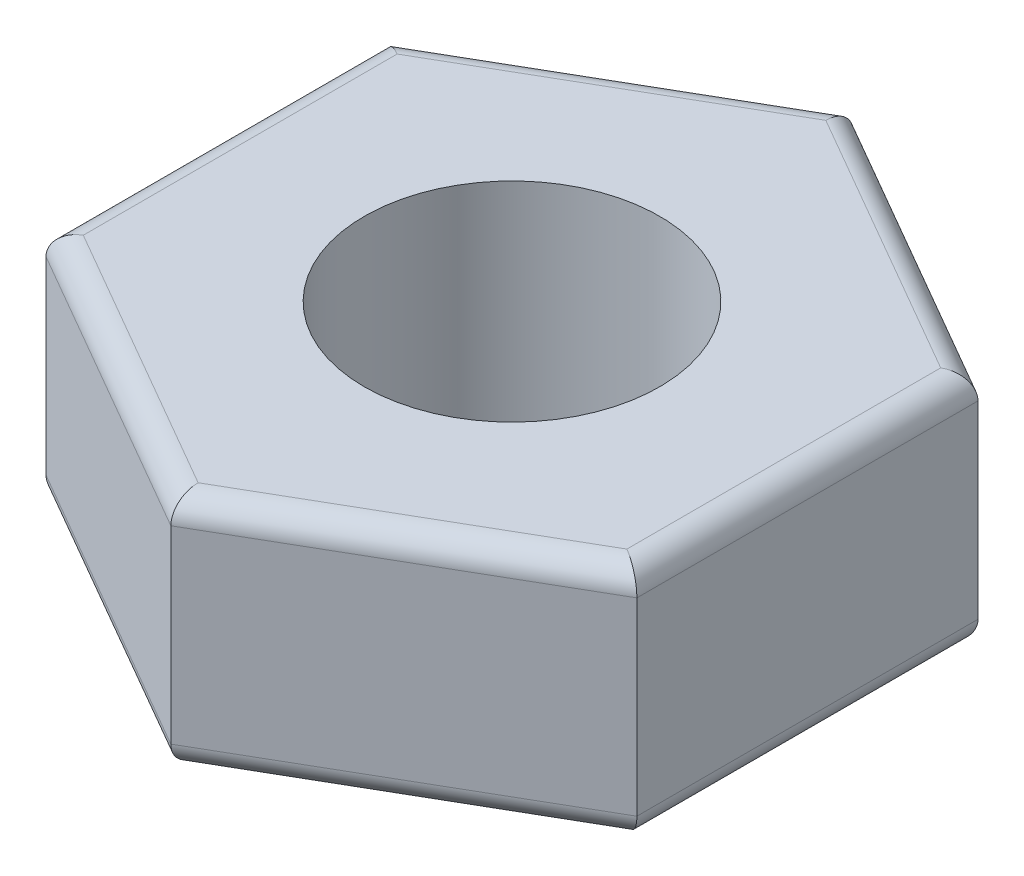
ISO-10303-21;
HEADER;
FILE_DESCRIPTION(('STEP AP214'),'2;1');
FILE_NAME('part.step','',(''),(''),'','','');
FILE_SCHEMA(('AUTOMOTIVE_DESIGN { 1 0 10303 214 1 1 1 1 }'));
ENDSEC;
DATA;
#1=APPLICATION_CONTEXT('core data for automotive mechanical design processes');
#2=APPLICATION_PROTOCOL_DEFINITION('international standard','automotive_design',2000,#1);
#3=PRODUCT_CONTEXT('',#1,'mechanical');
#4=PRODUCT('Part','Part','',(#3));
#5=PRODUCT_RELATED_PRODUCT_CATEGORY('part','',(#4));
#6=PRODUCT_DEFINITION_FORMATION('','',#4);
#7=PRODUCT_DEFINITION_CONTEXT('part definition',#1,'design');
#8=PRODUCT_DEFINITION('design','',#6,#7);
#9=PRODUCT_DEFINITION_SHAPE('','',#8);
#10=(LENGTH_UNIT() NAMED_UNIT(*) SI_UNIT(.MILLI.,.METRE.));
#11=(NAMED_UNIT(*) PLANE_ANGLE_UNIT() SI_UNIT($,.RADIAN.));
#12=(NAMED_UNIT(*) SI_UNIT($,.STERADIAN.) SOLID_ANGLE_UNIT());
#13=UNCERTAINTY_MEASURE_WITH_UNIT(LENGTH_MEASURE(1.E-05),#10,'distance_accuracy_value','');
#14=(GEOMETRIC_REPRESENTATION_CONTEXT(3) GLOBAL_UNCERTAINTY_ASSIGNED_CONTEXT((#13)) GLOBAL_UNIT_ASSIGNED_CONTEXT((#10,
#11,#12)) REPRESENTATION_CONTEXT('',''));
#15=CARTESIAN_POINT('',(0.,0.,0.));
#16=DIRECTION('',(0.,0.,1.));
#17=DIRECTION('',(1.,0.,0.));
#18=AXIS2_PLACEMENT_3D('',#15,#16,#17);
#19=CARTESIAN_POINT('',(0.,4.,0.));
#20=DIRECTION('',(0.,1.,0.));
#21=DIRECTION('',(0.,0.,1.));
#22=AXIS2_PLACEMENT_3D('',#19,#20,#21);
#23=PLANE('',#22);
#24=DIRECTION('',(-0.866025403784439,0.,0.5));
#25=VECTOR('',#24,1.);
#26=CARTESIAN_POINT('',(-4.8,4.,-2.54034118443435));
#27=LINE('',#26,#25);
#28=CARTESIAN_POINT('',(0.,4.,-5.31162247654456));
#29=VERTEX_POINT('',#28);
#30=CARTESIAN_POINT('',(-4.6,4.,-2.65581123827228));
#31=VERTEX_POINT('',#30);
#32=EDGE_CURVE('E52',#29,#31,#27,.T.);
#33=ORIENTED_EDGE('',*,*,#32,.T.);
#34=DIRECTION('',(0.,0.,1.));
#35=VECTOR('',#34,1.);
#36=CARTESIAN_POINT('',(-4.6,4.,2.88675134594813));
#37=LINE('',#36,#35);
#38=CARTESIAN_POINT('',(-4.6,4.,2.65581123827228));
#39=VERTEX_POINT('',#38);
#40=EDGE_CURVE('E11',#31,#39,#37,.T.);
#41=ORIENTED_EDGE('',*,*,#40,.T.);
#42=DIRECTION('',(0.866025403784439,0.,0.5));
#43=VECTOR('',#42,1.);
#44=CARTESIAN_POINT('',(0.200000000000001,4.,5.42709253038248));
#45=LINE('',#44,#43);
#46=CARTESIAN_POINT('',(0.,4.,5.31162247654456));
#47=VERTEX_POINT('',#46);
#48=EDGE_CURVE('E196',#39,#47,#45,.T.);
#49=ORIENTED_EDGE('',*,*,#48,.T.);
#50=DIRECTION('',(0.866025403784439,0.,-0.5));
#51=VECTOR('',#50,1.);
#52=CARTESIAN_POINT('',(4.8,4.,2.54034118443435));
#53=LINE('',#52,#51);
#54=CARTESIAN_POINT('',(4.6,4.,2.65581123827228));
#55=VERTEX_POINT('',#54);
#56=EDGE_CURVE('E194',#47,#55,#53,.T.);
#57=ORIENTED_EDGE('',*,*,#56,.T.);
#58=DIRECTION('',(0.,0.,-1.));
#59=VECTOR('',#58,1.);
#60=CARTESIAN_POINT('',(4.6,4.,-2.88675134594813));
#61=LINE('',#60,#59);
#62=CARTESIAN_POINT('',(4.6,4.,-2.65581123827228));
#63=VERTEX_POINT('',#62);
#64=EDGE_CURVE('E192',#55,#63,#61,.T.);
#65=ORIENTED_EDGE('',*,*,#64,.T.);
#66=DIRECTION('',(-0.866025403784439,0.,-0.5));
#67=VECTOR('',#66,1.);
#68=CARTESIAN_POINT('',(-0.200000000000001,4.,-5.42709253038248));
#69=LINE('',#68,#67);
#70=EDGE_CURVE('E63',#63,#29,#69,.T.);
#71=ORIENTED_EDGE('',*,*,#70,.T.);
#72=EDGE_LOOP('',(#33,#41,#49,#57,#65,#71));
#73=FACE_BOUND('',#72,.T.);
#74=CARTESIAN_POINT('',(0.,4.,0.));
#75=DIRECTION('',(0.,1.,0.));
#76=DIRECTION('',(0.,0.,1.));
#77=AXIS2_PLACEMENT_3D('',#74,#75,#76);
#78=CIRCLE('',#77,2.5);
#79=CARTESIAN_POINT('',(0.,4.,2.5));
#80=VERTEX_POINT('',#79);
#81=EDGE_CURVE('E240',#80,#80,#78,.T.);
#82=ORIENTED_EDGE('',*,*,#81,.F.);
#83=EDGE_LOOP('',(#82));
#84=FACE_BOUND('',#83,.T.);
#85=ADVANCED_FACE('F43',(#73,#84),#23,.T.);
#86=CARTESIAN_POINT('',(0.,0.,0.));
#87=DIRECTION('',(0.,1.,0.));
#88=DIRECTION('',(0.,0.,1.));
#89=AXIS2_PLACEMENT_3D('',#86,#87,#88);
#90=PLANE('',#89);
#91=DIRECTION('',(-0.866025403784439,0.,0.5));
#92=VECTOR('',#91,1.);
#93=CARTESIAN_POINT('',(-2.3,0.,-3.98371685740842));
#94=LINE('',#93,#92);
#95=CARTESIAN_POINT('',(-4.6,0.,-2.65581123827228));
#96=VERTEX_POINT('',#95);
#97=CARTESIAN_POINT('',(0.,0.,-5.31162247654456));
#98=VERTEX_POINT('',#97);
#99=EDGE_CURVE('E221',#96,#98,#94,.F.);
#100=ORIENTED_EDGE('',*,*,#99,.T.);
#101=DIRECTION('',(-0.866025403784439,0.,-0.5));
#102=VECTOR('',#101,1.);
#103=CARTESIAN_POINT('',(2.3,0.,-3.98371685740842));
#104=LINE('',#103,#102);
#105=CARTESIAN_POINT('',(4.6,0.,-2.65581123827228));
#106=VERTEX_POINT('',#105);
#107=EDGE_CURVE('E214',#98,#106,#104,.F.);
#108=ORIENTED_EDGE('',*,*,#107,.T.);
#109=DIRECTION('',(0.,0.,-1.));
#110=VECTOR('',#109,1.);
#111=CARTESIAN_POINT('',(4.6,0.,0.));
#112=LINE('',#111,#110);
#113=CARTESIAN_POINT('',(4.6,0.,2.65581123827228));
#114=VERTEX_POINT('',#113);
#115=EDGE_CURVE('E217',#106,#114,#112,.F.);
#116=ORIENTED_EDGE('',*,*,#115,.T.);
#117=DIRECTION('',(0.866025403784439,0.,-0.5));
#118=VECTOR('',#117,1.);
#119=CARTESIAN_POINT('',(2.3,0.,3.98371685740842));
#120=LINE('',#119,#118);
#121=CARTESIAN_POINT('',(0.,0.,5.31162247654456));
#122=VERTEX_POINT('',#121);
#123=EDGE_CURVE('E219',#114,#122,#120,.F.);
#124=ORIENTED_EDGE('',*,*,#123,.T.);
#125=DIRECTION('',(0.866025403784439,0.,0.5));
#126=VECTOR('',#125,1.);
#127=CARTESIAN_POINT('',(-2.3,0.,3.98371685740842));
#128=LINE('',#127,#126);
#129=CARTESIAN_POINT('',(-4.6,0.,2.65581123827228));
#130=VERTEX_POINT('',#129);
#131=EDGE_CURVE('E225',#122,#130,#128,.F.);
#132=ORIENTED_EDGE('',*,*,#131,.T.);
#133=DIRECTION('',(0.,0.,1.));
#134=VECTOR('',#133,1.);
#135=CARTESIAN_POINT('',(-4.6,0.,0.));
#136=LINE('',#135,#134);
#137=EDGE_CURVE('E223',#130,#96,#136,.F.);
#138=ORIENTED_EDGE('',*,*,#137,.T.);
#139=EDGE_LOOP('',(#100,#108,#116,#124,#132,#138));
#140=FACE_BOUND('',#139,.T.);
#141=CARTESIAN_POINT('',(0.,0.,0.));
#142=DIRECTION('',(0.,1.,0.));
#143=DIRECTION('',(0.,0.,1.));
#144=AXIS2_PLACEMENT_3D('',#141,#142,#143);
#145=CIRCLE('',#144,2.5);
#146=CARTESIAN_POINT('',(0.,0.,2.5));
#147=VERTEX_POINT('',#146);
#148=EDGE_CURVE('E176',#147,#147,#145,.T.);
#149=ORIENTED_EDGE('',*,*,#148,.T.);
#150=EDGE_LOOP('',(#149));
#151=FACE_BOUND('',#150,.T.);
#152=ADVANCED_FACE('F250',(#140,#151),#90,.F.);
#153=CARTESIAN_POINT('',(5.,4.,-2.88675134594813));
#154=DIRECTION('',(-0.5,0.,0.866025403784439));
#155=DIRECTION('',(0.866025403784439,0.,0.5));
#156=AXIS2_PLACEMENT_3D('',#153,#154,#155);
#157=PLANE('',#156);
#158=DIRECTION('',(0.,-1.,0.));
#159=VECTOR('',#158,1.);
#160=CARTESIAN_POINT('',(5.,4.,-2.88675134594813));
#161=LINE('',#160,#159);
#162=CARTESIAN_POINT('',(5.,3.6,-2.88675134594813));
#163=VERTEX_POINT('',#162);
#164=CARTESIAN_POINT('',(5.,0.4,-2.88675134594813));
#165=VERTEX_POINT('',#164);
#166=EDGE_CURVE('E238',#163,#165,#161,.T.);
#167=ORIENTED_EDGE('',*,*,#166,.T.);
#168=DIRECTION('',(-0.866025403784439,0.,-0.5));
#169=VECTOR('',#168,1.);
#170=CARTESIAN_POINT('',(5.,0.4,-2.88675134594813));
#171=LINE('',#170,#169);
#172=CARTESIAN_POINT('',(0.,0.4,-5.77350269189626));
#173=VERTEX_POINT('',#172);
#174=EDGE_CURVE('E153',#165,#173,#171,.T.);
#175=ORIENTED_EDGE('',*,*,#174,.T.);
#176=DIRECTION('',(0.,-1.,0.));
#177=VECTOR('',#176,1.);
#178=CARTESIAN_POINT('',(0.,4.,-5.77350269189626));
#179=LINE('',#178,#177);
#180=CARTESIAN_POINT('',(0.,3.6,-5.77350269189626));
#181=VERTEX_POINT('',#180);
#182=EDGE_CURVE('E136',#181,#173,#179,.T.);
#183=ORIENTED_EDGE('',*,*,#182,.F.);
#184=DIRECTION('',(-0.866025403784439,0.,-0.5));
#185=VECTOR('',#184,1.);
#186=CARTESIAN_POINT('',(5.,3.6,-2.88675134594813));
#187=LINE('',#186,#185);
#188=EDGE_CURVE('E150',#181,#163,#187,.F.);
#189=ORIENTED_EDGE('',*,*,#188,.T.);
#190=EDGE_LOOP('',(#167,#175,#183,#189));
#191=FACE_BOUND('',#190,.T.);
#192=ADVANCED_FACE('F149',(#191),#157,.F.);
#193=CARTESIAN_POINT('',(0.,4.,-5.77350269189626));
#194=DIRECTION('',(0.5,0.,0.866025403784439));
#195=DIRECTION('',(0.866025403784439,0.,-0.5));
#196=AXIS2_PLACEMENT_3D('',#193,#194,#195);
#197=PLANE('',#196);
#198=ORIENTED_EDGE('',*,*,#182,.T.);
#199=DIRECTION('',(-0.866025403784439,0.,0.5));
#200=VECTOR('',#199,1.);
#201=CARTESIAN_POINT('',(0.,0.4,-5.77350269189626));
#202=LINE('',#201,#200);
#203=CARTESIAN_POINT('',(-5.,0.4,-2.88675134594813));
#204=VERTEX_POINT('',#203);
#205=EDGE_CURVE('E142',#173,#204,#202,.T.);
#206=ORIENTED_EDGE('',*,*,#205,.T.);
#207=DIRECTION('',(0.,-1.,0.));
#208=VECTOR('',#207,1.);
#209=CARTESIAN_POINT('',(-5.,4.,-2.88675134594813));
#210=LINE('',#209,#208);
#211=CARTESIAN_POINT('',(-5.,3.6,-2.88675134594813));
#212=VERTEX_POINT('',#211);
#213=EDGE_CURVE('E138',#212,#204,#210,.T.);
#214=ORIENTED_EDGE('',*,*,#213,.F.);
#215=DIRECTION('',(-0.866025403784439,0.,0.5));
#216=VECTOR('',#215,1.);
#217=CARTESIAN_POINT('',(0.,3.6,-5.77350269189626));
#218=LINE('',#217,#216);
#219=EDGE_CURVE('E133',#212,#181,#218,.F.);
#220=ORIENTED_EDGE('',*,*,#219,.T.);
#221=EDGE_LOOP('',(#198,#206,#214,#220));
#222=FACE_BOUND('',#221,.T.);
#223=ADVANCED_FACE('F135',(#222),#197,.F.);
#224=CARTESIAN_POINT('',(-5.,4.,-2.88675134594813));
#225=DIRECTION('',(1.,0.,0.));
#226=DIRECTION('',(0.,0.,-1.));
#227=AXIS2_PLACEMENT_3D('',#224,#225,#226);
#228=PLANE('',#227);
#229=ORIENTED_EDGE('',*,*,#213,.T.);
#230=DIRECTION('',(0.,0.,1.));
#231=VECTOR('',#230,1.);
#232=CARTESIAN_POINT('',(-5.,0.4,-2.88675134594813));
#233=LINE('',#232,#231);
#234=CARTESIAN_POINT('',(-5.,0.4,2.88675134594813));
#235=VERTEX_POINT('',#234);
#236=EDGE_CURVE('E202',#204,#235,#233,.T.);
#237=ORIENTED_EDGE('',*,*,#236,.T.);
#238=DIRECTION('',(0.,-1.,0.));
#239=VECTOR('',#238,1.);
#240=CARTESIAN_POINT('',(-5.,4.,2.88675134594813));
#241=LINE('',#240,#239);
#242=CARTESIAN_POINT('',(-5.,3.6,2.88675134594813));
#243=VERTEX_POINT('',#242);
#244=EDGE_CURVE('E229',#243,#235,#241,.T.);
#245=ORIENTED_EDGE('',*,*,#244,.F.);
#246=DIRECTION('',(0.,0.,1.));
#247=VECTOR('',#246,1.);
#248=CARTESIAN_POINT('',(-5.,3.6,-2.88675134594813));
#249=LINE('',#248,#247);
#250=EDGE_CURVE('E204',#243,#212,#249,.F.);
#251=ORIENTED_EDGE('',*,*,#250,.T.);
#252=EDGE_LOOP('',(#229,#237,#245,#251));
#253=FACE_BOUND('',#252,.T.);
#254=ADVANCED_FACE('F270',(#253),#228,.F.);
#255=CARTESIAN_POINT('',(-5.,4.,2.88675134594813));
#256=DIRECTION('',(0.5,0.,-0.866025403784439));
#257=DIRECTION('',(-0.866025403784439,0.,-0.5));
#258=AXIS2_PLACEMENT_3D('',#255,#256,#257);
#259=PLANE('',#258);
#260=ORIENTED_EDGE('',*,*,#244,.T.);
#261=DIRECTION('',(0.866025403784439,0.,0.5));
#262=VECTOR('',#261,1.);
#263=CARTESIAN_POINT('',(-5.,0.4,2.88675134594813));
#264=LINE('',#263,#262);
#265=CARTESIAN_POINT('',(0.,0.4,5.77350269189626));
#266=VERTEX_POINT('',#265);
#267=EDGE_CURVE('E198',#235,#266,#264,.T.);
#268=ORIENTED_EDGE('',*,*,#267,.T.);
#269=DIRECTION('',(0.,-1.,0.));
#270=VECTOR('',#269,1.);
#271=CARTESIAN_POINT('',(0.,4.,5.77350269189626));
#272=LINE('',#271,#270);
#273=CARTESIAN_POINT('',(0.,3.6,5.77350269189626));
#274=VERTEX_POINT('',#273);
#275=EDGE_CURVE('E232',#274,#266,#272,.T.);
#276=ORIENTED_EDGE('',*,*,#275,.F.);
#277=DIRECTION('',(0.866025403784439,0.,0.5));
#278=VECTOR('',#277,1.);
#279=CARTESIAN_POINT('',(-5.,3.6,2.88675134594813));
#280=LINE('',#279,#278);
#281=EDGE_CURVE('E200',#274,#243,#280,.F.);
#282=ORIENTED_EDGE('',*,*,#281,.T.);
#283=EDGE_LOOP('',(#260,#268,#276,#282));
#284=FACE_BOUND('',#283,.T.);
#285=ADVANCED_FACE('F266',(#284),#259,.F.);
#286=CARTESIAN_POINT('',(0.,4.,5.77350269189626));
#287=DIRECTION('',(-0.5,0.,-0.866025403784439));
#288=DIRECTION('',(-0.866025403784439,0.,0.5));
#289=AXIS2_PLACEMENT_3D('',#286,#287,#288);
#290=PLANE('',#289);
#291=ORIENTED_EDGE('',*,*,#275,.T.);
#292=DIRECTION('',(0.866025403784439,0.,-0.5));
#293=VECTOR('',#292,1.);
#294=CARTESIAN_POINT('',(0.,0.4,5.77350269189626));
#295=LINE('',#294,#293);
#296=CARTESIAN_POINT('',(5.,0.4,2.88675134594813));
#297=VERTEX_POINT('',#296);
#298=EDGE_CURVE('E143',#266,#297,#295,.T.);
#299=ORIENTED_EDGE('',*,*,#298,.T.);
#300=DIRECTION('',(0.,-1.,0.));
#301=VECTOR('',#300,1.);
#302=CARTESIAN_POINT('',(5.,4.,2.88675134594813));
#303=LINE('',#302,#301);
#304=CARTESIAN_POINT('',(5.,3.6,2.88675134594813));
#305=VERTEX_POINT('',#304);
#306=EDGE_CURVE('E235',#305,#297,#303,.T.);
#307=ORIENTED_EDGE('',*,*,#306,.F.);
#308=DIRECTION('',(0.866025403784439,0.,-0.5));
#309=VECTOR('',#308,1.);
#310=CARTESIAN_POINT('',(0.,3.6,5.77350269189626));
#311=LINE('',#310,#309);
#312=EDGE_CURVE('E208',#305,#274,#311,.F.);
#313=ORIENTED_EDGE('',*,*,#312,.T.);
#314=EDGE_LOOP('',(#291,#299,#307,#313));
#315=FACE_BOUND('',#314,.T.);
#316=ADVANCED_FACE('F262',(#315),#290,.F.);
#317=CARTESIAN_POINT('',(5.,4.,2.88675134594813));
#318=DIRECTION('',(-1.,0.,0.));
#319=DIRECTION('',(0.,0.,1.));
#320=AXIS2_PLACEMENT_3D('',#317,#318,#319);
#321=PLANE('',#320);
#322=ORIENTED_EDGE('',*,*,#306,.T.);
#323=DIRECTION('',(0.,0.,-1.));
#324=VECTOR('',#323,1.);
#325=CARTESIAN_POINT('',(5.,0.4,2.88675134594813));
#326=LINE('',#325,#324);
#327=EDGE_CURVE('E210',#297,#165,#326,.T.);
#328=ORIENTED_EDGE('',*,*,#327,.T.);
#329=ORIENTED_EDGE('',*,*,#166,.F.);
#330=DIRECTION('',(0.,0.,-1.));
#331=VECTOR('',#330,1.);
#332=CARTESIAN_POINT('',(5.,3.6,2.88675134594813));
#333=LINE('',#332,#331);
#334=EDGE_CURVE('E212',#163,#305,#333,.F.);
#335=ORIENTED_EDGE('',*,*,#334,.T.);
#336=EDGE_LOOP('',(#322,#328,#329,#335));
#337=FACE_BOUND('',#336,.T.);
#338=ADVANCED_FACE('F259',(#337),#321,.F.);
#339=CARTESIAN_POINT('',(0.,4.,0.));
#340=DIRECTION('',(0.,-1.,0.));
#341=DIRECTION('',(0.,0.,-1.));
#342=AXIS2_PLACEMENT_3D('',#339,#340,#341);
#343=CYLINDRICAL_SURFACE('',#342,2.5);
#344=ORIENTED_EDGE('',*,*,#81,.T.);
#345=EDGE_LOOP('',(#344));
#346=FACE_BOUND('',#345,.T.);
#347=ORIENTED_EDGE('',*,*,#148,.F.);
#348=EDGE_LOOP('',(#347));
#349=FACE_BOUND('',#348,.T.);
#350=ADVANCED_FACE('F246',(#346,#349),#343,.F.);
#351=CARTESIAN_POINT('',(-4.8,0.4,2.54034118443435));
#352=DIRECTION('',(0.866025403784439,0.,0.5));
#353=DIRECTION('',(0.5,0.,-0.866025403784439));
#354=AXIS2_PLACEMENT_3D('',#351,#352,#353);
#355=CYLINDRICAL_SURFACE('',#354,0.4);
#356=CARTESIAN_POINT('',(-4.6,0.4,2.65581123827228));
#357=DIRECTION('',(0.5,0.,0.866025403784438));
#358=DIRECTION('',(0.866025403784439,0.,-0.5));
#359=AXIS2_PLACEMENT_3D('',#356,#357,#358);
#360=ELLIPSE('',#359,0.461880215351701,0.4);
#361=EDGE_CURVE('E177',#130,#235,#360,.F.);
#362=ORIENTED_EDGE('',*,*,#361,.F.);
#363=ORIENTED_EDGE('',*,*,#131,.F.);
#364=CARTESIAN_POINT('',(0.,0.4,5.31162247654456));
#365=DIRECTION('',(1.,0.,0.));
#366=DIRECTION('',(0.,0.,1.));
#367=AXIS2_PLACEMENT_3D('',#364,#365,#366);
#368=ELLIPSE('',#367,0.461880215351701,0.4);
#369=EDGE_CURVE('E173',#266,#122,#368,.T.);
#370=ORIENTED_EDGE('',*,*,#369,.F.);
#371=ORIENTED_EDGE('',*,*,#267,.F.);
#372=EDGE_LOOP('',(#362,#363,#370,#371));
#373=FACE_BOUND('',#372,.T.);
#374=ADVANCED_FACE('F298',(#373),#355,.T.);
#375=CARTESIAN_POINT('',(-0.199999999999999,0.4,5.42709253038248));
#376=DIRECTION('',(0.866025403784439,0.,-0.5));
#377=DIRECTION('',(-0.5,0.,-0.866025403784439));
#378=AXIS2_PLACEMENT_3D('',#375,#376,#377);
#379=CYLINDRICAL_SURFACE('',#378,0.4);
#380=ORIENTED_EDGE('',*,*,#369,.T.);
#381=ORIENTED_EDGE('',*,*,#123,.F.);
#382=CARTESIAN_POINT('',(4.6,0.4,2.65581123827228));
#383=DIRECTION('',(0.5,0.,-0.866025403784439));
#384=DIRECTION('',(0.866025403784439,0.,0.5));
#385=AXIS2_PLACEMENT_3D('',#382,#383,#384);
#386=ELLIPSE('',#385,0.461880215351701,0.4);
#387=EDGE_CURVE('E180',#297,#114,#386,.T.);
#388=ORIENTED_EDGE('',*,*,#387,.F.);
#389=ORIENTED_EDGE('',*,*,#298,.F.);
#390=EDGE_LOOP('',(#380,#381,#388,#389));
#391=FACE_BOUND('',#390,.T.);
#392=ADVANCED_FACE('F294',(#391),#379,.T.);
#393=CARTESIAN_POINT('',(-4.6,0.4,-2.88675134594813));
#394=DIRECTION('',(0.,0.,1.));
#395=DIRECTION('',(1.,0.,0.));
#396=AXIS2_PLACEMENT_3D('',#393,#394,#395);
#397=CYLINDRICAL_SURFACE('',#396,0.4);
#398=ORIENTED_EDGE('',*,*,#361,.T.);
#399=ORIENTED_EDGE('',*,*,#236,.F.);
#400=CARTESIAN_POINT('',(-4.6,0.4,-2.65581123827228));
#401=DIRECTION('',(-0.5,0.,0.866025403784439));
#402=DIRECTION('',(0.866025403784439,0.,0.5));
#403=AXIS2_PLACEMENT_3D('',#400,#401,#402);
#404=ELLIPSE('',#403,0.461880215351701,0.4);
#405=EDGE_CURVE('E183',#96,#204,#404,.F.);
#406=ORIENTED_EDGE('',*,*,#405,.F.);
#407=ORIENTED_EDGE('',*,*,#137,.F.);
#408=EDGE_LOOP('',(#398,#399,#406,#407));
#409=FACE_BOUND('',#408,.T.);
#410=ADVANCED_FACE('F290',(#409),#397,.T.);
#411=CARTESIAN_POINT('',(4.6,0.4,2.88675134594813));
#412=DIRECTION('',(0.,0.,-1.));
#413=DIRECTION('',(-1.,0.,0.));
#414=AXIS2_PLACEMENT_3D('',#411,#412,#413);
#415=CYLINDRICAL_SURFACE('',#414,0.4);
#416=ORIENTED_EDGE('',*,*,#387,.T.);
#417=ORIENTED_EDGE('',*,*,#115,.F.);
#418=CARTESIAN_POINT('',(4.6,0.4,-2.65581123827228));
#419=DIRECTION('',(-0.5,0.,-0.866025403784438));
#420=DIRECTION('',(0.866025403784438,0.,-0.5));
#421=AXIS2_PLACEMENT_3D('',#418,#419,#420);
#422=ELLIPSE('',#421,0.461880215351701,0.4);
#423=EDGE_CURVE('E186',#165,#106,#422,.T.);
#424=ORIENTED_EDGE('',*,*,#423,.F.);
#425=ORIENTED_EDGE('',*,*,#327,.F.);
#426=EDGE_LOOP('',(#416,#417,#424,#425));
#427=FACE_BOUND('',#426,.T.);
#428=ADVANCED_FACE('F286',(#427),#415,.T.);
#429=CARTESIAN_POINT('',(0.199999999999999,0.4,-5.42709253038248));
#430=DIRECTION('',(-0.866025403784439,0.,0.5));
#431=DIRECTION('',(0.5,0.,0.866025403784439));
#432=AXIS2_PLACEMENT_3D('',#429,#430,#431);
#433=CYLINDRICAL_SURFACE('',#432,0.4);
#434=ORIENTED_EDGE('',*,*,#405,.T.);
#435=ORIENTED_EDGE('',*,*,#205,.F.);
#436=CARTESIAN_POINT('',(0.,0.4,-5.31162247654456));
#437=DIRECTION('',(-1.,0.,0.));
#438=DIRECTION('',(0.,0.,1.));
#439=AXIS2_PLACEMENT_3D('',#436,#437,#438);
#440=ELLIPSE('',#439,0.461880215351701,0.4);
#441=EDGE_CURVE('E188',#98,#173,#440,.F.);
#442=ORIENTED_EDGE('',*,*,#441,.F.);
#443=ORIENTED_EDGE('',*,*,#99,.F.);
#444=EDGE_LOOP('',(#434,#435,#442,#443));
#445=FACE_BOUND('',#444,.T.);
#446=ADVANCED_FACE('F282',(#445),#433,.T.);
#447=CARTESIAN_POINT('',(4.8,0.4,-2.54034118443435));
#448=DIRECTION('',(-0.866025403784439,0.,-0.5));
#449=DIRECTION('',(-0.5,0.,0.866025403784439));
#450=AXIS2_PLACEMENT_3D('',#447,#448,#449);
#451=CYLINDRICAL_SURFACE('',#450,0.4);
#452=ORIENTED_EDGE('',*,*,#423,.T.);
#453=ORIENTED_EDGE('',*,*,#107,.F.);
#454=ORIENTED_EDGE('',*,*,#441,.T.);
#455=ORIENTED_EDGE('',*,*,#174,.F.);
#456=EDGE_LOOP('',(#452,#453,#454,#455));
#457=FACE_BOUND('',#456,.T.);
#458=ADVANCED_FACE('F279',(#457),#451,.T.);
#459=CARTESIAN_POINT('',(4.6,3.6,0.));
#460=DIRECTION('',(0.,0.,1.));
#461=DIRECTION('',(1.,0.,0.));
#462=AXIS2_PLACEMENT_3D('',#459,#460,#461);
#463=CYLINDRICAL_SURFACE('',#462,0.4);
#464=CARTESIAN_POINT('',(4.6,3.6,2.65581123827228));
#465=DIRECTION('',(-0.5,0.,0.866025403784439));
#466=DIRECTION('',(-0.866025403784439,0.,-0.5));
#467=AXIS2_PLACEMENT_3D('',#464,#465,#466);
#468=ELLIPSE('',#467,0.461880215351701,0.4);
#469=EDGE_CURVE('E162',#305,#55,#468,.T.);
#470=ORIENTED_EDGE('',*,*,#469,.F.);
#471=ORIENTED_EDGE('',*,*,#334,.F.);
#472=CARTESIAN_POINT('',(4.6,3.6,-2.65581123827228));
#473=DIRECTION('',(0.5,0.,0.866025403784438));
#474=DIRECTION('',(-0.866025403784438,0.,0.5));
#475=AXIS2_PLACEMENT_3D('',#472,#473,#474);
#476=ELLIPSE('',#475,0.461880215351701,0.4);
#477=EDGE_CURVE('E47',#63,#163,#476,.F.);
#478=ORIENTED_EDGE('',*,*,#477,.F.);
#479=ORIENTED_EDGE('',*,*,#64,.F.);
#480=EDGE_LOOP('',(#470,#471,#478,#479));
#481=FACE_BOUND('',#480,.T.);
#482=ADVANCED_FACE('F45',(#481),#463,.T.);
#483=CARTESIAN_POINT('',(2.3,3.6,-3.98371685740842));
#484=DIRECTION('',(0.866025403784439,0.,0.5));
#485=DIRECTION('',(0.5,0.,-0.866025403784439));
#486=AXIS2_PLACEMENT_3D('',#483,#484,#485);
#487=CYLINDRICAL_SURFACE('',#486,0.4);
#488=ORIENTED_EDGE('',*,*,#477,.T.);
#489=ORIENTED_EDGE('',*,*,#188,.F.);
#490=CARTESIAN_POINT('',(0.,3.6,-5.31162247654456));
#491=DIRECTION('',(1.,0.,0.));
#492=DIRECTION('',(0.,0.,1.));
#493=AXIS2_PLACEMENT_3D('',#490,#491,#492);
#494=ELLIPSE('',#493,0.461880215351701,0.4);
#495=EDGE_CURVE('E158',#29,#181,#494,.F.);
#496=ORIENTED_EDGE('',*,*,#495,.F.);
#497=ORIENTED_EDGE('',*,*,#70,.F.);
#498=EDGE_LOOP('',(#488,#489,#496,#497));
#499=FACE_BOUND('',#498,.T.);
#500=ADVANCED_FACE('F157',(#499),#487,.T.);
#501=CARTESIAN_POINT('',(2.3,3.6,3.98371685740842));
#502=DIRECTION('',(-0.866025403784439,0.,0.5));
#503=DIRECTION('',(0.5,0.,0.866025403784439));
#504=AXIS2_PLACEMENT_3D('',#501,#502,#503);
#505=CYLINDRICAL_SURFACE('',#504,0.4);
#506=ORIENTED_EDGE('',*,*,#469,.T.);
#507=ORIENTED_EDGE('',*,*,#56,.F.);
#508=CARTESIAN_POINT('',(0.,3.6,5.31162247654456));
#509=DIRECTION('',(-1.,0.,0.));
#510=DIRECTION('',(0.,0.,-1.));
#511=AXIS2_PLACEMENT_3D('',#508,#509,#510);
#512=ELLIPSE('',#511,0.461880215351701,0.4);
#513=EDGE_CURVE('E163',#274,#47,#512,.T.);
#514=ORIENTED_EDGE('',*,*,#513,.F.);
#515=ORIENTED_EDGE('',*,*,#312,.F.);
#516=EDGE_LOOP('',(#506,#507,#514,#515));
#517=FACE_BOUND('',#516,.T.);
#518=ADVANCED_FACE('F313',(#517),#505,.T.);
#519=CARTESIAN_POINT('',(-2.3,3.6,-3.98371685740842));
#520=DIRECTION('',(0.866025403784439,0.,-0.5));
#521=DIRECTION('',(-0.5,0.,-0.866025403784439));
#522=AXIS2_PLACEMENT_3D('',#519,#520,#521);
#523=CYLINDRICAL_SURFACE('',#522,0.4);
#524=ORIENTED_EDGE('',*,*,#495,.T.);
#525=ORIENTED_EDGE('',*,*,#219,.F.);
#526=CARTESIAN_POINT('',(-4.6,3.6,-2.65581123827228));
#527=DIRECTION('',(0.5,0.,-0.866025403784439));
#528=DIRECTION('',(0.866025403784439,0.,0.5));
#529=AXIS2_PLACEMENT_3D('',#526,#527,#528);
#530=ELLIPSE('',#529,0.461880215351701,0.4);
#531=EDGE_CURVE('E167',#31,#212,#530,.F.);
#532=ORIENTED_EDGE('',*,*,#531,.F.);
#533=ORIENTED_EDGE('',*,*,#32,.F.);
#534=EDGE_LOOP('',(#524,#525,#532,#533));
#535=FACE_BOUND('',#534,.T.);
#536=ADVANCED_FACE('F161',(#535),#523,.T.);
#537=CARTESIAN_POINT('',(-2.3,3.6,3.98371685740842));
#538=DIRECTION('',(-0.866025403784439,0.,-0.5));
#539=DIRECTION('',(-0.5,0.,0.866025403784439));
#540=AXIS2_PLACEMENT_3D('',#537,#538,#539);
#541=CYLINDRICAL_SURFACE('',#540,0.4);
#542=ORIENTED_EDGE('',*,*,#513,.T.);
#543=ORIENTED_EDGE('',*,*,#48,.F.);
#544=CARTESIAN_POINT('',(-4.6,3.6,2.65581123827228));
#545=DIRECTION('',(-0.5,0.,-0.866025403784438));
#546=DIRECTION('',(-0.866025403784439,0.,0.5));
#547=AXIS2_PLACEMENT_3D('',#544,#545,#546);
#548=ELLIPSE('',#547,0.461880215351701,0.4);
#549=EDGE_CURVE('E171',#243,#39,#548,.T.);
#550=ORIENTED_EDGE('',*,*,#549,.F.);
#551=ORIENTED_EDGE('',*,*,#281,.F.);
#552=EDGE_LOOP('',(#542,#543,#550,#551));
#553=FACE_BOUND('',#552,.T.);
#554=ADVANCED_FACE('F306',(#553),#541,.T.);
#555=CARTESIAN_POINT('',(-4.6,3.6,0.));
#556=DIRECTION('',(0.,0.,-1.));
#557=DIRECTION('',(-1.,0.,0.));
#558=AXIS2_PLACEMENT_3D('',#555,#556,#557);
#559=CYLINDRICAL_SURFACE('',#558,0.4);
#560=ORIENTED_EDGE('',*,*,#531,.T.);
#561=ORIENTED_EDGE('',*,*,#250,.F.);
#562=ORIENTED_EDGE('',*,*,#549,.T.);
#563=ORIENTED_EDGE('',*,*,#40,.F.);
#564=EDGE_LOOP('',(#560,#561,#562,#563));
#565=FACE_BOUND('',#564,.T.);
#566=ADVANCED_FACE('F303',(#565),#559,.T.);
#567=CLOSED_SHELL('',(#85,#152,#192,#223,#254,#285,#316,#338,#350,#374,#392,#410,#428,#446,#458,
#482,#500,#518,#536,#554,#566));
#568=MANIFOLD_SOLID_BREP('B2',#567);
#569=ADVANCED_BREP_SHAPE_REPRESENTATION('',(#18,#568),#14);
#570=SHAPE_DEFINITION_REPRESENTATION(#9,#569);
ENDSEC;
END-ISO-10303-21;
